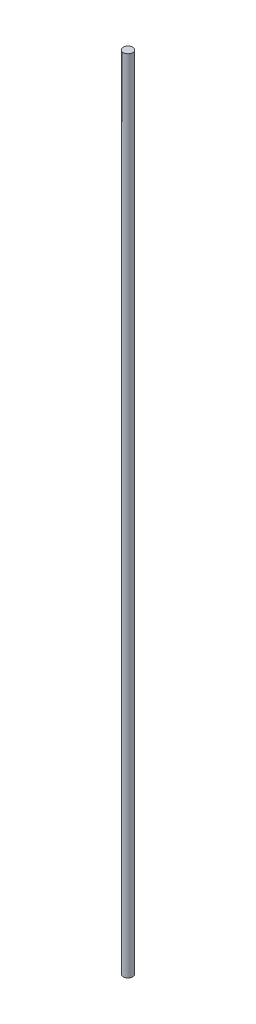
ISO-10303-21;
HEADER;
FILE_DESCRIPTION(('STEP AP214'),'2;1');
FILE_NAME('part.step','',(''),(''),'','','');
FILE_SCHEMA(('AUTOMOTIVE_DESIGN { 1 0 10303 214 1 1 1 1 }'));
ENDSEC;
DATA;
#1=APPLICATION_CONTEXT('core data for automotive mechanical design processes');
#2=APPLICATION_PROTOCOL_DEFINITION('international standard','automotive_design',2000,#1);
#3=PRODUCT_CONTEXT('',#1,'mechanical');
#4=PRODUCT('Part','Part','',(#3));
#5=PRODUCT_RELATED_PRODUCT_CATEGORY('part','',(#4));
#6=PRODUCT_DEFINITION_FORMATION('','',#4);
#7=PRODUCT_DEFINITION_CONTEXT('part definition',#1,'design');
#8=PRODUCT_DEFINITION('design','',#6,#7);
#9=PRODUCT_DEFINITION_SHAPE('','',#8);
#10=(LENGTH_UNIT() NAMED_UNIT(*) SI_UNIT(.MILLI.,.METRE.));
#11=(NAMED_UNIT(*) PLANE_ANGLE_UNIT() SI_UNIT($,.RADIAN.));
#12=(NAMED_UNIT(*) SI_UNIT($,.STERADIAN.) SOLID_ANGLE_UNIT());
#13=UNCERTAINTY_MEASURE_WITH_UNIT(LENGTH_MEASURE(1.E-05),#10,'distance_accuracy_value','');
#14=(GEOMETRIC_REPRESENTATION_CONTEXT(3) GLOBAL_UNCERTAINTY_ASSIGNED_CONTEXT((#13)) GLOBAL_UNIT_ASSIGNED_CONTEXT((#10,
#11,#12)) REPRESENTATION_CONTEXT('',''));
#15=CARTESIAN_POINT('',(0.,0.,0.));
#16=DIRECTION('',(0.,0.,1.));
#17=DIRECTION('',(1.,0.,0.));
#18=AXIS2_PLACEMENT_3D('',#15,#16,#17);
#19=CARTESIAN_POINT('',(0.,84.,0.));
#20=DIRECTION('',(0.,-1.,0.));
#21=DIRECTION('',(0.,0.,-1.));
#22=AXIS2_PLACEMENT_3D('',#19,#20,#21);
#23=CYLINDRICAL_SURFACE('',#22,0.5);
#24=CARTESIAN_POINT('',(0.,84.,0.));
#25=DIRECTION('',(0.,1.,0.));
#26=DIRECTION('',(0.,0.,1.));
#27=AXIS2_PLACEMENT_3D('',#24,#25,#26);
#28=CIRCLE('',#27,0.5);
#29=CARTESIAN_POINT('',(0.,84.,0.5));
#30=VERTEX_POINT('',#29);
#31=EDGE_CURVE('E10',#30,#30,#28,.T.);
#32=ORIENTED_EDGE('',*,*,#31,.F.);
#33=EDGE_LOOP('',(#32));
#34=FACE_BOUND('',#33,.T.);
#35=CARTESIAN_POINT('',(0.,0.,0.));
#36=DIRECTION('',(0.,1.,0.));
#37=DIRECTION('',(0.,0.,1.));
#38=AXIS2_PLACEMENT_3D('',#35,#36,#37);
#39=CIRCLE('',#38,0.5);
#40=CARTESIAN_POINT('',(0.,0.,0.5));
#41=VERTEX_POINT('',#40);
#42=EDGE_CURVE('E40',#41,#41,#39,.T.);
#43=ORIENTED_EDGE('',*,*,#42,.T.);
#44=EDGE_LOOP('',(#43));
#45=FACE_BOUND('',#44,.T.);
#46=ADVANCED_FACE('F37',(#34,#45),#23,.T.);
#47=CARTESIAN_POINT('',(0.,84.,0.));
#48=DIRECTION('',(0.,1.,0.));
#49=DIRECTION('',(0.,0.,1.));
#50=AXIS2_PLACEMENT_3D('',#47,#48,#49);
#51=PLANE('',#50);
#52=ORIENTED_EDGE('',*,*,#31,.T.);
#53=EDGE_LOOP('',(#52));
#54=FACE_BOUND('',#53,.T.);
#55=ADVANCED_FACE('F52',(#54),#51,.T.);
#56=CARTESIAN_POINT('',(0.,0.,0.));
#57=DIRECTION('',(0.,1.,0.));
#58=DIRECTION('',(0.,0.,1.));
#59=AXIS2_PLACEMENT_3D('',#56,#57,#58);
#60=PLANE('',#59);
#61=ORIENTED_EDGE('',*,*,#42,.F.);
#62=EDGE_LOOP('',(#61));
#63=FACE_BOUND('',#62,.T.);
#64=ADVANCED_FACE('F50',(#63),#60,.F.);
#65=CLOSED_SHELL('',(#46,#55,#64));
#66=MANIFOLD_SOLID_BREP('B2',#65);
#67=ADVANCED_BREP_SHAPE_REPRESENTATION('',(#18,#66),#14);
#68=SHAPE_DEFINITION_REPRESENTATION(#9,#67);
ENDSEC;
END-ISO-10303-21;
